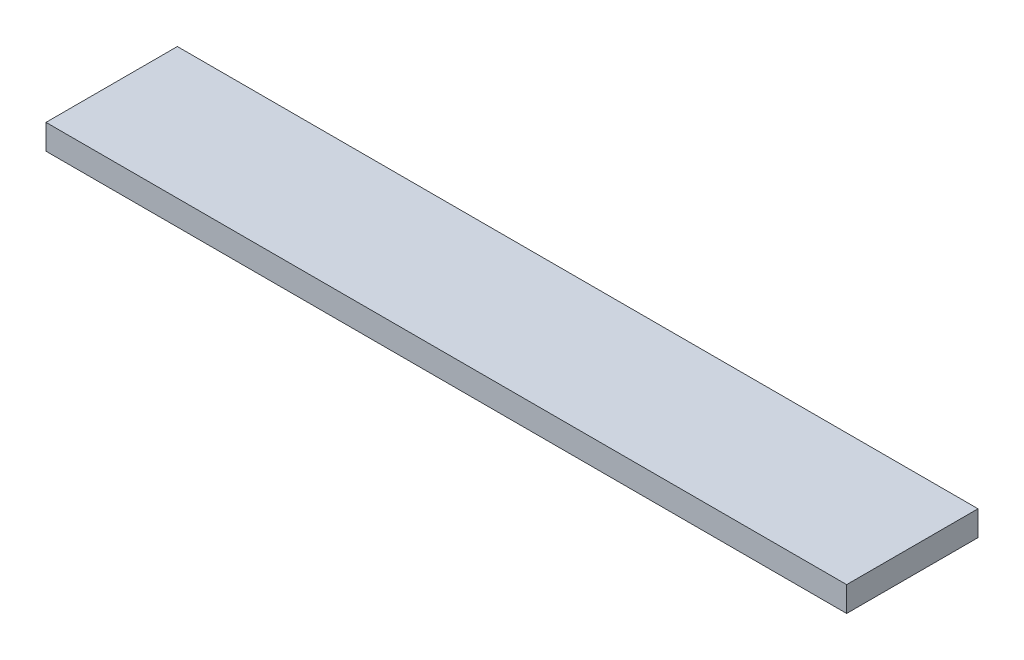
ISO-10303-21;
HEADER;
FILE_DESCRIPTION(('STEP AP214'),'2;1');
FILE_NAME('part.step','',(''),(''),'','','');
FILE_SCHEMA(('AUTOMOTIVE_DESIGN { 1 0 10303 214 1 1 1 1 }'));
ENDSEC;
DATA;
#1=APPLICATION_CONTEXT('core data for automotive mechanical design processes');
#2=APPLICATION_PROTOCOL_DEFINITION('international standard','automotive_design',2000,#1);
#3=PRODUCT_CONTEXT('',#1,'mechanical');
#4=PRODUCT('Part','Part','',(#3));
#5=PRODUCT_RELATED_PRODUCT_CATEGORY('part','',(#4));
#6=PRODUCT_DEFINITION_FORMATION('','',#4);
#7=PRODUCT_DEFINITION_CONTEXT('part definition',#1,'design');
#8=PRODUCT_DEFINITION('design','',#6,#7);
#9=PRODUCT_DEFINITION_SHAPE('','',#8);
#10=(LENGTH_UNIT() NAMED_UNIT(*) SI_UNIT(.MILLI.,.METRE.));
#11=(NAMED_UNIT(*) PLANE_ANGLE_UNIT() SI_UNIT($,.RADIAN.));
#12=(NAMED_UNIT(*) SI_UNIT($,.STERADIAN.) SOLID_ANGLE_UNIT());
#13=UNCERTAINTY_MEASURE_WITH_UNIT(LENGTH_MEASURE(1.E-05),#10,'distance_accuracy_value','');
#14=(GEOMETRIC_REPRESENTATION_CONTEXT(3) GLOBAL_UNCERTAINTY_ASSIGNED_CONTEXT((#13)) GLOBAL_UNIT_ASSIGNED_CONTEXT((#10,
#11,#12)) REPRESENTATION_CONTEXT('',''));
#15=CARTESIAN_POINT('',(0.,0.,0.));
#16=DIRECTION('',(0.,0.,1.));
#17=DIRECTION('',(1.,0.,0.));
#18=AXIS2_PLACEMENT_3D('',#15,#16,#17);
#19=CARTESIAN_POINT('',(64.,4.,10.5));
#20=DIRECTION('',(-1.,0.,0.));
#21=DIRECTION('',(0.,0.,1.));
#22=AXIS2_PLACEMENT_3D('',#19,#20,#21);
#23=PLANE('',#22);
#24=DIRECTION('',(0.,0.,-1.));
#25=VECTOR('',#24,1.);
#26=CARTESIAN_POINT('',(64.,0.,10.5));
#27=LINE('',#26,#25);
#28=CARTESIAN_POINT('',(64.,0.,10.5));
#29=VERTEX_POINT('',#28);
#30=CARTESIAN_POINT('',(64.,0.,-10.5));
#31=VERTEX_POINT('',#30);
#32=EDGE_CURVE('E96',#29,#31,#27,.T.);
#33=ORIENTED_EDGE('',*,*,#32,.T.);
#34=DIRECTION('',(0.,-1.,0.));
#35=VECTOR('',#34,1.);
#36=CARTESIAN_POINT('',(64.,4.,-10.5));
#37=LINE('',#36,#35);
#38=CARTESIAN_POINT('',(64.,4.,-10.5));
#39=VERTEX_POINT('',#38);
#40=EDGE_CURVE('E11',#39,#31,#37,.T.);
#41=ORIENTED_EDGE('',*,*,#40,.F.);
#42=DIRECTION('',(0.,0.,-1.));
#43=VECTOR('',#42,1.);
#44=CARTESIAN_POINT('',(64.,4.,10.5));
#45=LINE('',#44,#43);
#46=CARTESIAN_POINT('',(64.,4.,10.5));
#47=VERTEX_POINT('',#46);
#48=EDGE_CURVE('E84',#47,#39,#45,.T.);
#49=ORIENTED_EDGE('',*,*,#48,.F.);
#50=DIRECTION('',(0.,-1.,0.));
#51=VECTOR('',#50,1.);
#52=CARTESIAN_POINT('',(64.,4.,10.5));
#53=LINE('',#52,#51);
#54=EDGE_CURVE('E92',#47,#29,#53,.T.);
#55=ORIENTED_EDGE('',*,*,#54,.T.);
#56=EDGE_LOOP('',(#33,#41,#49,#55));
#57=FACE_BOUND('',#56,.T.);
#58=ADVANCED_FACE('F33',(#57),#23,.F.);
#59=CARTESIAN_POINT('',(-64.,4.,-10.5));
#60=DIRECTION('',(0.,0.,1.));
#61=DIRECTION('',(1.,0.,0.));
#62=AXIS2_PLACEMENT_3D('',#59,#60,#61);
#63=PLANE('',#62);
#64=DIRECTION('',(-1.,0.,0.));
#65=VECTOR('',#64,1.);
#66=CARTESIAN_POINT('',(-64.,0.,-10.5));
#67=LINE('',#66,#65);
#68=CARTESIAN_POINT('',(-64.,0.,-10.5));
#69=VERTEX_POINT('',#68);
#70=EDGE_CURVE('E88',#31,#69,#67,.T.);
#71=ORIENTED_EDGE('',*,*,#70,.T.);
#72=DIRECTION('',(0.,-1.,0.));
#73=VECTOR('',#72,1.);
#74=CARTESIAN_POINT('',(-64.,4.,-10.5));
#75=LINE('',#74,#73);
#76=CARTESIAN_POINT('',(-64.,4.,-10.5));
#77=VERTEX_POINT('',#76);
#78=EDGE_CURVE('E41',#77,#69,#75,.T.);
#79=ORIENTED_EDGE('',*,*,#78,.F.);
#80=DIRECTION('',(-1.,0.,0.));
#81=VECTOR('',#80,1.);
#82=CARTESIAN_POINT('',(-64.,4.,-10.5));
#83=LINE('',#82,#81);
#84=EDGE_CURVE('E79',#39,#77,#83,.T.);
#85=ORIENTED_EDGE('',*,*,#84,.F.);
#86=ORIENTED_EDGE('',*,*,#40,.T.);
#87=EDGE_LOOP('',(#71,#79,#85,#86));
#88=FACE_BOUND('',#87,.T.);
#89=ADVANCED_FACE('F87',(#88),#63,.F.);
#90=CARTESIAN_POINT('',(-64.,4.,10.5));
#91=DIRECTION('',(1.,0.,0.));
#92=DIRECTION('',(0.,0.,-1.));
#93=AXIS2_PLACEMENT_3D('',#90,#91,#92);
#94=PLANE('',#93);
#95=DIRECTION('',(0.,0.,1.));
#96=VECTOR('',#95,1.);
#97=CARTESIAN_POINT('',(-64.,0.,10.5));
#98=LINE('',#97,#96);
#99=CARTESIAN_POINT('',(-64.,0.,10.5));
#100=VERTEX_POINT('',#99);
#101=EDGE_CURVE('E66',#69,#100,#98,.T.);
#102=ORIENTED_EDGE('',*,*,#101,.T.);
#103=DIRECTION('',(0.,-1.,0.));
#104=VECTOR('',#103,1.);
#105=CARTESIAN_POINT('',(-64.,4.,10.5));
#106=LINE('',#105,#104);
#107=CARTESIAN_POINT('',(-64.,4.,10.5));
#108=VERTEX_POINT('',#107);
#109=EDGE_CURVE('E89',#108,#100,#106,.T.);
#110=ORIENTED_EDGE('',*,*,#109,.F.);
#111=DIRECTION('',(0.,0.,1.));
#112=VECTOR('',#111,1.);
#113=CARTESIAN_POINT('',(-64.,4.,10.5));
#114=LINE('',#113,#112);
#115=EDGE_CURVE('E82',#77,#108,#114,.T.);
#116=ORIENTED_EDGE('',*,*,#115,.F.);
#117=ORIENTED_EDGE('',*,*,#78,.T.);
#118=EDGE_LOOP('',(#102,#110,#116,#117));
#119=FACE_BOUND('',#118,.T.);
#120=ADVANCED_FACE('F90',(#119),#94,.F.);
#121=CARTESIAN_POINT('',(-64.,4.,10.5));
#122=DIRECTION('',(0.,0.,-1.));
#123=DIRECTION('',(-1.,0.,0.));
#124=AXIS2_PLACEMENT_3D('',#121,#122,#123);
#125=PLANE('',#124);
#126=DIRECTION('',(1.,0.,0.));
#127=VECTOR('',#126,1.);
#128=CARTESIAN_POINT('',(-64.,0.,10.5));
#129=LINE('',#128,#127);
#130=EDGE_CURVE('E72',#100,#29,#129,.T.);
#131=ORIENTED_EDGE('',*,*,#130,.T.);
#132=ORIENTED_EDGE('',*,*,#54,.F.);
#133=DIRECTION('',(1.,0.,0.));
#134=VECTOR('',#133,1.);
#135=CARTESIAN_POINT('',(-64.,4.,10.5));
#136=LINE('',#135,#134);
#137=EDGE_CURVE('E49',#108,#47,#136,.T.);
#138=ORIENTED_EDGE('',*,*,#137,.F.);
#139=ORIENTED_EDGE('',*,*,#109,.T.);
#140=EDGE_LOOP('',(#131,#132,#138,#139));
#141=FACE_BOUND('',#140,.T.);
#142=ADVANCED_FACE('F103',(#141),#125,.F.);
#143=CARTESIAN_POINT('',(0.,4.,0.));
#144=DIRECTION('',(0.,-1.,0.));
#145=DIRECTION('',(0.,0.,-1.));
#146=AXIS2_PLACEMENT_3D('',#143,#144,#145);
#147=PLANE('',#146);
#148=ORIENTED_EDGE('',*,*,#48,.T.);
#149=ORIENTED_EDGE('',*,*,#84,.T.);
#150=ORIENTED_EDGE('',*,*,#115,.T.);
#151=ORIENTED_EDGE('',*,*,#137,.T.);
#152=EDGE_LOOP('',(#148,#149,#150,#151));
#153=FACE_BOUND('',#152,.T.);
#154=ADVANCED_FACE('F80',(#153),#147,.F.);
#155=CARTESIAN_POINT('',(0.,0.,0.));
#156=DIRECTION('',(0.,-1.,0.));
#157=DIRECTION('',(0.,0.,-1.));
#158=AXIS2_PLACEMENT_3D('',#155,#156,#157);
#159=PLANE('',#158);
#160=ORIENTED_EDGE('',*,*,#32,.F.);
#161=ORIENTED_EDGE('',*,*,#130,.F.);
#162=ORIENTED_EDGE('',*,*,#101,.F.);
#163=ORIENTED_EDGE('',*,*,#70,.F.);
#164=EDGE_LOOP('',(#160,#161,#162,#163));
#165=FACE_BOUND('',#164,.T.);
#166=ADVANCED_FACE('F106',(#165),#159,.T.);
#167=CLOSED_SHELL('',(#58,#89,#120,#142,#154,#166));
#168=MANIFOLD_SOLID_BREP('B2',#167);
#169=ADVANCED_BREP_SHAPE_REPRESENTATION('',(#18,#168),#14);
#170=SHAPE_DEFINITION_REPRESENTATION(#9,#169);
ENDSEC;
END-ISO-10303-21;
